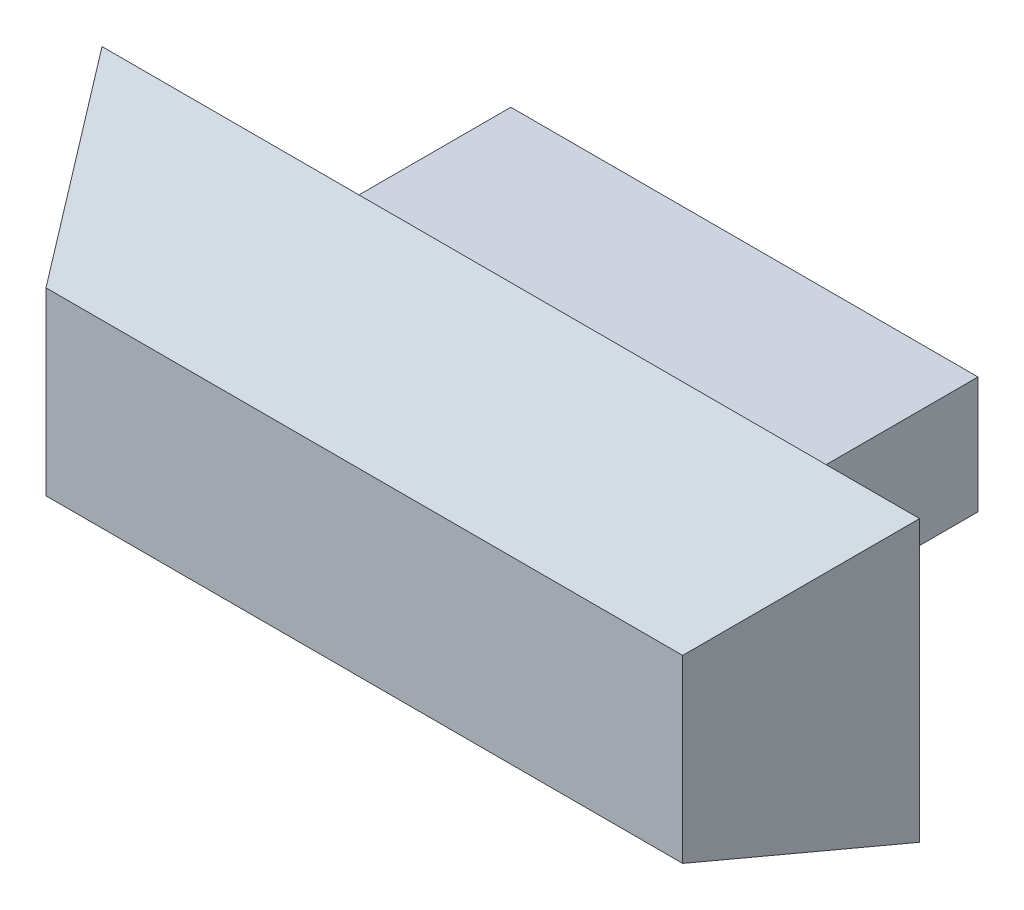
ISO-10303-21;
HEADER;
FILE_DESCRIPTION(('STEP AP214'),'2;1');
FILE_NAME('part.step','',(''),(''),'','','');
FILE_SCHEMA(('AUTOMOTIVE_DESIGN { 1 0 10303 214 1 1 1 1 }'));
ENDSEC;
DATA;
#1=APPLICATION_CONTEXT('core data for automotive mechanical design processes');
#2=APPLICATION_PROTOCOL_DEFINITION('international standard','automotive_design',2000,#1);
#3=PRODUCT_CONTEXT('',#1,'mechanical');
#4=PRODUCT('Part','Part','',(#3));
#5=PRODUCT_RELATED_PRODUCT_CATEGORY('part','',(#4));
#6=PRODUCT_DEFINITION_FORMATION('','',#4);
#7=PRODUCT_DEFINITION_CONTEXT('part definition',#1,'design');
#8=PRODUCT_DEFINITION('design','',#6,#7);
#9=PRODUCT_DEFINITION_SHAPE('','',#8);
#10=(LENGTH_UNIT() NAMED_UNIT(*) SI_UNIT(.MILLI.,.METRE.));
#11=(NAMED_UNIT(*) PLANE_ANGLE_UNIT() SI_UNIT($,.RADIAN.));
#12=(NAMED_UNIT(*) SI_UNIT($,.STERADIAN.) SOLID_ANGLE_UNIT());
#13=UNCERTAINTY_MEASURE_WITH_UNIT(LENGTH_MEASURE(1.E-05),#10,'distance_accuracy_value','');
#14=(GEOMETRIC_REPRESENTATION_CONTEXT(3) GLOBAL_UNCERTAINTY_ASSIGNED_CONTEXT((#13)) GLOBAL_UNIT_ASSIGNED_CONTEXT((#10,
#11,#12)) REPRESENTATION_CONTEXT('',''));
#15=CARTESIAN_POINT('',(0.,0.,0.));
#16=DIRECTION('',(0.,0.,1.));
#17=DIRECTION('',(1.,0.,0.));
#18=AXIS2_PLACEMENT_3D('',#15,#16,#17);
#19=CARTESIAN_POINT('',(0.,0.,2.54));
#20=DIRECTION('',(0.,0.,-1.));
#21=DIRECTION('',(-1.,0.,0.));
#22=AXIS2_PLACEMENT_3D('',#19,#20,#21);
#23=PLANE('',#22);
#24=DIRECTION('',(0.,-1.,0.));
#25=VECTOR('',#24,1.);
#26=CARTESIAN_POINT('',(74.1685271470526,0.,2.54));
#27=LINE('',#26,#25);
#28=CARTESIAN_POINT('',(74.1685271470526,66.7564090512267,2.54));
#29=VERTEX_POINT('',#28);
#30=CARTESIAN_POINT('',(74.1685271470526,64.3075909487768,2.54));
#31=VERTEX_POINT('',#30);
#32=EDGE_CURVE('E140',#29,#31,#27,.T.);
#33=ORIENTED_EDGE('',*,*,#32,.T.);
#34=DIRECTION('',(1.,0.,0.));
#35=VECTOR('',#34,1.);
#36=CARTESIAN_POINT('',(0.,64.3075909487768,2.54));
#37=LINE('',#36,#35);
#38=CARTESIAN_POINT('',(82.8219090512249,64.3075909487768,2.54));
#39=VERTEX_POINT('',#38);
#40=EDGE_CURVE('E147',#31,#39,#37,.T.);
#41=ORIENTED_EDGE('',*,*,#40,.T.);
#42=DIRECTION('',(0.,1.,0.));
#43=VECTOR('',#42,1.);
#44=CARTESIAN_POINT('',(82.8219090512249,0.,2.54));
#45=LINE('',#44,#43);
#46=CARTESIAN_POINT('',(82.8219090512249,66.7564090512267,2.54));
#47=VERTEX_POINT('',#46);
#48=EDGE_CURVE('E145',#39,#47,#45,.T.);
#49=ORIENTED_EDGE('',*,*,#48,.T.);
#50=DIRECTION('',(-1.,0.,0.));
#51=VECTOR('',#50,1.);
#52=CARTESIAN_POINT('',(0.,66.7564090512267,2.54));
#53=LINE('',#52,#51);
#54=EDGE_CURVE('E143',#47,#29,#53,.T.);
#55=ORIENTED_EDGE('',*,*,#54,.T.);
#56=EDGE_LOOP('',(#33,#41,#49,#55));
#57=FACE_BOUND('',#56,.T.);
#58=ADVANCED_FACE('F35',(#57),#23,.F.);
#59=CARTESIAN_POINT('',(0.,0.,0.));
#60=DIRECTION('',(0.,0.,-1.));
#61=DIRECTION('',(-1.,0.,0.));
#62=AXIS2_PLACEMENT_3D('',#59,#60,#61);
#63=PLANE('',#62);
#64=DIRECTION('',(0.,-1.,0.));
#65=VECTOR('',#64,1.);
#66=CARTESIAN_POINT('',(81.1212499999999,64.7382500000018,0.));
#67=LINE('',#66,#65);
#68=CARTESIAN_POINT('',(81.1212499999999,66.3257500000018,0.));
#69=VERTEX_POINT('',#68);
#70=CARTESIAN_POINT('',(81.1212499999999,64.7382500000018,0.));
#71=VERTEX_POINT('',#70);
#72=EDGE_CURVE('E53',#69,#71,#67,.T.);
#73=ORIENTED_EDGE('',*,*,#72,.F.);
#74=DIRECTION('',(1.,0.,0.));
#75=VECTOR('',#74,1.);
#76=CARTESIAN_POINT('',(74.77125,66.3257500000018,0.));
#77=LINE('',#76,#75);
#78=CARTESIAN_POINT('',(74.77125,66.3257500000018,0.));
#79=VERTEX_POINT('',#78);
#80=EDGE_CURVE('E57',#79,#69,#77,.T.);
#81=ORIENTED_EDGE('',*,*,#80,.F.);
#82=DIRECTION('',(0.,1.,0.));
#83=VECTOR('',#82,1.);
#84=CARTESIAN_POINT('',(74.77125,64.7382500000018,0.));
#85=LINE('',#84,#83);
#86=CARTESIAN_POINT('',(74.77125,64.7382500000018,0.));
#87=VERTEX_POINT('',#86);
#88=EDGE_CURVE('E258',#87,#79,#85,.T.);
#89=ORIENTED_EDGE('',*,*,#88,.F.);
#90=DIRECTION('',(-1.,0.,0.));
#91=VECTOR('',#90,1.);
#92=CARTESIAN_POINT('',(74.77125,64.7382500000018,0.));
#93=LINE('',#92,#91);
#94=EDGE_CURVE('E264',#71,#87,#93,.T.);
#95=ORIENTED_EDGE('',*,*,#94,.F.);
#96=EDGE_LOOP('',(#73,#81,#89,#95));
#97=FACE_BOUND('',#96,.T.);
#98=DIRECTION('',(0.,1.,0.));
#99=VECTOR('',#98,1.);
#100=CARTESIAN_POINT('',(83.5025,67.4370000000018,0.));
#101=LINE('',#100,#99);
#102=CARTESIAN_POINT('',(83.5025,63.6270000000018,0.));
#103=VERTEX_POINT('',#102);
#104=CARTESIAN_POINT('',(83.5025,67.4370000000018,0.));
#105=VERTEX_POINT('',#104);
#106=EDGE_CURVE('E128',#103,#105,#101,.T.);
#107=ORIENTED_EDGE('',*,*,#106,.F.);
#108=DIRECTION('',(1.,0.,0.));
#109=VECTOR('',#108,1.);
#110=CARTESIAN_POINT('',(83.5025,63.6270000000018,0.));
#111=LINE('',#110,#109);
#112=CARTESIAN_POINT('',(72.39,63.6270000000018,0.));
#113=VERTEX_POINT('',#112);
#114=EDGE_CURVE('E137',#113,#103,#111,.T.);
#115=ORIENTED_EDGE('',*,*,#114,.F.);
#116=DIRECTION('',(0.,-1.,0.));
#117=VECTOR('',#116,1.);
#118=CARTESIAN_POINT('',(72.39,67.4370000000018,0.));
#119=LINE('',#118,#117);
#120=CARTESIAN_POINT('',(72.39,67.4370000000018,0.));
#121=VERTEX_POINT('',#120);
#122=EDGE_CURVE('E134',#121,#113,#119,.T.);
#123=ORIENTED_EDGE('',*,*,#122,.F.);
#124=DIRECTION('',(-1.,0.,0.));
#125=VECTOR('',#124,1.);
#126=CARTESIAN_POINT('',(83.5025,67.4370000000018,0.));
#127=LINE('',#126,#125);
#128=EDGE_CURVE('E131',#105,#121,#127,.T.);
#129=ORIENTED_EDGE('',*,*,#128,.F.);
#130=EDGE_LOOP('',(#107,#115,#123,#129));
#131=FACE_BOUND('',#130,.T.);
#132=ADVANCED_FACE('F159',(#97,#131),#63,.T.);
#133=CARTESIAN_POINT('',(74.1685271470526,0.,2.54));
#134=DIRECTION('',(0.819152044288993,0.,-0.573576436351044));
#135=DIRECTION('',(0.,-1.,0.));
#136=AXIS2_PLACEMENT_3D('',#133,#134,#135);
#137=PLANE('',#136);
#138=ORIENTED_EDGE('',*,*,#122,.T.);
#139=DIRECTION('',(0.56024001110492,0.2143876641588,0.800105655156676));
#140=VECTOR('',#139,1.);
#141=CARTESIAN_POINT('',(66.4446358146759,61.3518809171088,-8.49086001062649));
#142=LINE('',#141,#140);
#143=EDGE_CURVE('E11',#113,#31,#142,.T.);
#144=ORIENTED_EDGE('',*,*,#143,.T.);
#145=ORIENTED_EDGE('',*,*,#32,.F.);
#146=DIRECTION('',(-0.56024001110492,0.2143876641588,-0.800105655156676));
#147=VECTOR('',#146,1.);
#148=CARTESIAN_POINT('',(82.1865424644367,63.6881462691857,13.9909125935499));
#149=LINE('',#148,#147);
#150=EDGE_CURVE('E45',#29,#121,#149,.T.);
#151=ORIENTED_EDGE('',*,*,#150,.T.);
#152=EDGE_LOOP('',(#138,#144,#145,#151));
#153=FACE_BOUND('',#152,.T.);
#154=ADVANCED_FACE('F154',(#153),#137,.F.);
#155=CARTESIAN_POINT('',(0.,66.7564090512267,2.54));
#156=DIRECTION('',(0.,-0.96592582628907,-0.258819045102514));
#157=DIRECTION('',(-1.,0.,0.));
#158=AXIS2_PLACEMENT_3D('',#155,#156,#157);
#159=PLANE('',#158);
#160=ORIENTED_EDGE('',*,*,#150,.F.);
#161=ORIENTED_EDGE('',*,*,#54,.F.);
#162=DIRECTION('',(0.250562807085725,0.250562807085725,-0.935113126531033));
#163=VECTOR('',#162,1.);
#164=CARTESIAN_POINT('',(77.6222071228996,61.5567071229014,21.9455517807244));
#165=LINE('',#164,#163);
#166=EDGE_CURVE('E40',#105,#47,#165,.F.);
#167=ORIENTED_EDGE('',*,*,#166,.F.);
#168=ORIENTED_EDGE('',*,*,#128,.T.);
#169=EDGE_LOOP('',(#160,#161,#167,#168));
#170=FACE_BOUND('',#169,.T.);
#171=ADVANCED_FACE('F38',(#170),#159,.F.);
#172=CARTESIAN_POINT('',(82.8219090512249,0.,2.54));
#173=DIRECTION('',(-0.96592582628907,0.,-0.258819045102514));
#174=DIRECTION('',(0.,1.,0.));
#175=AXIS2_PLACEMENT_3D('',#172,#173,#174);
#176=PLANE('',#175);
#177=ORIENTED_EDGE('',*,*,#166,.T.);
#178=ORIENTED_EDGE('',*,*,#48,.F.);
#179=DIRECTION('',(0.250562807085725,-0.250562807085725,-0.935113126531033));
#180=VECTOR('',#179,1.);
#181=CARTESIAN_POINT('',(86.8592502389956,60.2702497610061,-12.5275624402512));
#182=LINE('',#181,#180);
#183=EDGE_CURVE('E122',#103,#39,#182,.F.);
#184=ORIENTED_EDGE('',*,*,#183,.F.);
#185=ORIENTED_EDGE('',*,*,#106,.T.);
#186=EDGE_LOOP('',(#177,#178,#184,#185));
#187=FACE_BOUND('',#186,.T.);
#188=ADVANCED_FACE('F165',(#187),#176,.F.);
#189=CARTESIAN_POINT('',(0.,64.3075909487768,2.54));
#190=DIRECTION('',(0.,0.96592582628907,-0.258819045102514));
#191=DIRECTION('',(1.,0.,0.));
#192=AXIS2_PLACEMENT_3D('',#189,#190,#191);
#193=PLANE('',#192);
#194=ORIENTED_EDGE('',*,*,#143,.F.);
#195=ORIENTED_EDGE('',*,*,#114,.T.);
#196=ORIENTED_EDGE('',*,*,#183,.T.);
#197=ORIENTED_EDGE('',*,*,#40,.F.);
#198=EDGE_LOOP('',(#194,#195,#196,#197));
#199=FACE_BOUND('',#198,.T.);
#200=ADVANCED_FACE('F167',(#199),#193,.F.);
#201=CARTESIAN_POINT('',(81.1212499999999,64.7382500000018,-3.175));
#202=DIRECTION('',(-1.,0.,0.));
#203=DIRECTION('',(0.,0.,1.));
#204=AXIS2_PLACEMENT_3D('',#201,#202,#203);
#205=PLANE('',#204);
#206=ORIENTED_EDGE('',*,*,#72,.T.);
#207=DIRECTION('',(0.,0.,1.));
#208=VECTOR('',#207,1.);
#209=CARTESIAN_POINT('',(81.1212499999999,64.7382500000018,-3.175));
#210=LINE('',#209,#208);
#211=CARTESIAN_POINT('',(81.1212499999999,64.7382500000018,-3.175));
#212=VERTEX_POINT('',#211);
#213=EDGE_CURVE('E105',#212,#71,#210,.T.);
#214=ORIENTED_EDGE('',*,*,#213,.F.);
#215=DIRECTION('',(0.,-1.,0.));
#216=VECTOR('',#215,1.);
#217=CARTESIAN_POINT('',(81.1212499999999,64.7382500000018,-3.175));
#218=LINE('',#217,#216);
#219=CARTESIAN_POINT('',(81.1212499999999,66.3257500000018,-3.175));
#220=VERTEX_POINT('',#219);
#221=EDGE_CURVE('E111',#220,#212,#218,.T.);
#222=ORIENTED_EDGE('',*,*,#221,.F.);
#223=DIRECTION('',(0.,0.,1.));
#224=VECTOR('',#223,1.);
#225=CARTESIAN_POINT('',(81.1212499999999,66.3257500000018,-3.175));
#226=LINE('',#225,#224);
#227=EDGE_CURVE('E256',#220,#69,#226,.T.);
#228=ORIENTED_EDGE('',*,*,#227,.T.);
#229=EDGE_LOOP('',(#206,#214,#222,#228));
#230=FACE_BOUND('',#229,.T.);
#231=ADVANCED_FACE('F121',(#230),#205,.F.);
#232=CARTESIAN_POINT('',(74.77125,64.7382500000018,-3.175));
#233=DIRECTION('',(0.,1.,0.));
#234=DIRECTION('',(0.,0.,1.));
#235=AXIS2_PLACEMENT_3D('',#232,#233,#234);
#236=PLANE('',#235);
#237=ORIENTED_EDGE('',*,*,#94,.T.);
#238=DIRECTION('',(0.,0.,1.));
#239=VECTOR('',#238,1.);
#240=CARTESIAN_POINT('',(74.77125,64.7382500000018,-3.175));
#241=LINE('',#240,#239);
#242=CARTESIAN_POINT('',(74.77125,64.7382500000018,-3.175));
#243=VERTEX_POINT('',#242);
#244=EDGE_CURVE('E107',#243,#87,#241,.T.);
#245=ORIENTED_EDGE('',*,*,#244,.F.);
#246=DIRECTION('',(-1.,0.,0.));
#247=VECTOR('',#246,1.);
#248=CARTESIAN_POINT('',(74.77125,64.7382500000018,-3.175));
#249=LINE('',#248,#247);
#250=EDGE_CURVE('E100',#212,#243,#249,.T.);
#251=ORIENTED_EDGE('',*,*,#250,.F.);
#252=ORIENTED_EDGE('',*,*,#213,.T.);
#253=EDGE_LOOP('',(#237,#245,#251,#252));
#254=FACE_BOUND('',#253,.T.);
#255=ADVANCED_FACE('F103',(#254),#236,.F.);
#256=CARTESIAN_POINT('',(74.77125,64.7382500000018,-3.175));
#257=DIRECTION('',(1.,0.,0.));
#258=DIRECTION('',(0.,0.,-1.));
#259=AXIS2_PLACEMENT_3D('',#256,#257,#258);
#260=PLANE('',#259);
#261=ORIENTED_EDGE('',*,*,#88,.T.);
#262=DIRECTION('',(0.,0.,1.));
#263=VECTOR('',#262,1.);
#264=CARTESIAN_POINT('',(74.77125,66.3257500000018,-3.175));
#265=LINE('',#264,#263);
#266=CARTESIAN_POINT('',(74.77125,66.3257500000018,-3.175));
#267=VERTEX_POINT('',#266);
#268=EDGE_CURVE('E124',#267,#79,#265,.T.);
#269=ORIENTED_EDGE('',*,*,#268,.F.);
#270=DIRECTION('',(0.,1.,0.));
#271=VECTOR('',#270,1.);
#272=CARTESIAN_POINT('',(74.77125,64.7382500000018,-3.175));
#273=LINE('',#272,#271);
#274=EDGE_CURVE('E110',#243,#267,#273,.T.);
#275=ORIENTED_EDGE('',*,*,#274,.F.);
#276=ORIENTED_EDGE('',*,*,#244,.T.);
#277=EDGE_LOOP('',(#261,#269,#275,#276));
#278=FACE_BOUND('',#277,.T.);
#279=ADVANCED_FACE('F225',(#278),#260,.F.);
#280=CARTESIAN_POINT('',(74.77125,66.3257500000018,-3.175));
#281=DIRECTION('',(0.,-1.,0.));
#282=DIRECTION('',(0.,0.,-1.));
#283=AXIS2_PLACEMENT_3D('',#280,#281,#282);
#284=PLANE('',#283);
#285=ORIENTED_EDGE('',*,*,#80,.T.);
#286=ORIENTED_EDGE('',*,*,#227,.F.);
#287=DIRECTION('',(1.,0.,0.));
#288=VECTOR('',#287,1.);
#289=CARTESIAN_POINT('',(74.77125,66.3257500000018,-3.175));
#290=LINE('',#289,#288);
#291=EDGE_CURVE('E116',#267,#220,#290,.T.);
#292=ORIENTED_EDGE('',*,*,#291,.F.);
#293=ORIENTED_EDGE('',*,*,#268,.T.);
#294=EDGE_LOOP('',(#285,#286,#292,#293));
#295=FACE_BOUND('',#294,.T.);
#296=ADVANCED_FACE('F233',(#295),#284,.F.);
#297=CARTESIAN_POINT('',(0.,0.,-3.175));
#298=DIRECTION('',(0.,0.,-1.));
#299=DIRECTION('',(-1.,0.,0.));
#300=AXIS2_PLACEMENT_3D('',#297,#298,#299);
#301=PLANE('',#300);
#302=ORIENTED_EDGE('',*,*,#221,.T.);
#303=ORIENTED_EDGE('',*,*,#250,.T.);
#304=ORIENTED_EDGE('',*,*,#274,.T.);
#305=ORIENTED_EDGE('',*,*,#291,.T.);
#306=EDGE_LOOP('',(#302,#303,#304,#305));
#307=FACE_BOUND('',#306,.T.);
#308=ADVANCED_FACE('F114',(#307),#301,.T.);
#309=CLOSED_SHELL('',(#58,#132,#154,#171,#188,#200,#231,#255,#279,#296,#308));
#310=MANIFOLD_SOLID_BREP('B2',#309);
#311=ADVANCED_BREP_SHAPE_REPRESENTATION('',(#18,#310),#14);
#312=SHAPE_DEFINITION_REPRESENTATION(#9,#311);
ENDSEC;
END-ISO-10303-21;
